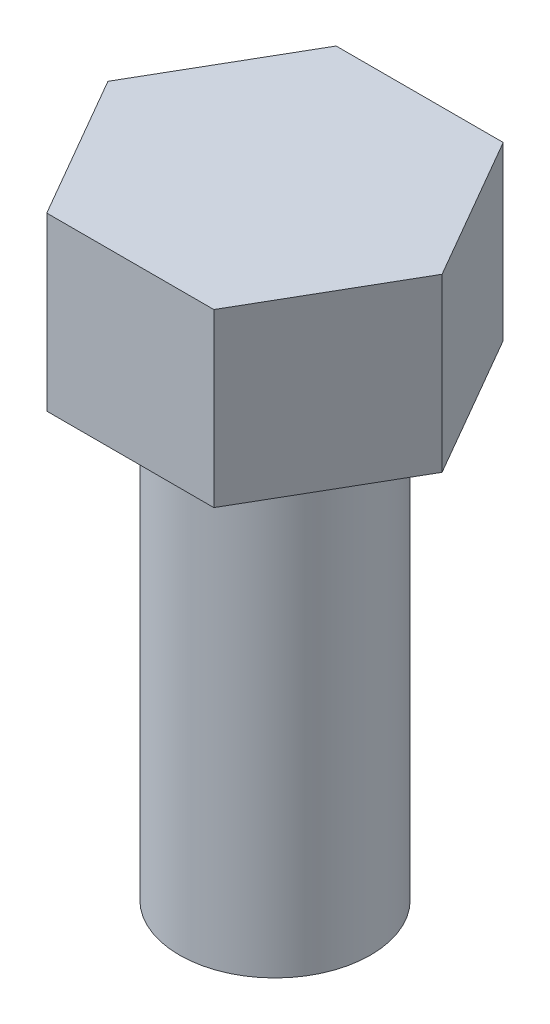
ISO-10303-21;
HEADER;
FILE_DESCRIPTION(('STEP AP214'),'2;1');
FILE_NAME('part.step','',(''),(''),'','','');
FILE_SCHEMA(('AUTOMOTIVE_DESIGN { 1 0 10303 214 1 1 1 1 }'));
ENDSEC;
DATA;
#1=APPLICATION_CONTEXT('core data for automotive mechanical design processes');
#2=APPLICATION_PROTOCOL_DEFINITION('international standard','automotive_design',2000,#1);
#3=PRODUCT_CONTEXT('',#1,'mechanical');
#4=PRODUCT('Part','Part','',(#3));
#5=PRODUCT_RELATED_PRODUCT_CATEGORY('part','',(#4));
#6=PRODUCT_DEFINITION_FORMATION('','',#4);
#7=PRODUCT_DEFINITION_CONTEXT('part definition',#1,'design');
#8=PRODUCT_DEFINITION('design','',#6,#7);
#9=PRODUCT_DEFINITION_SHAPE('','',#8);
#10=(LENGTH_UNIT() NAMED_UNIT(*) SI_UNIT(.MILLI.,.METRE.));
#11=(NAMED_UNIT(*) PLANE_ANGLE_UNIT() SI_UNIT($,.RADIAN.));
#12=(NAMED_UNIT(*) SI_UNIT($,.STERADIAN.) SOLID_ANGLE_UNIT());
#13=UNCERTAINTY_MEASURE_WITH_UNIT(LENGTH_MEASURE(1.E-05),#10,'distance_accuracy_value','');
#14=(GEOMETRIC_REPRESENTATION_CONTEXT(3) GLOBAL_UNCERTAINTY_ASSIGNED_CONTEXT((#13)) GLOBAL_UNIT_ASSIGNED_CONTEXT((#10,
#11,#12)) REPRESENTATION_CONTEXT('',''));
#15=CARTESIAN_POINT('',(0.,0.,0.));
#16=DIRECTION('',(0.,0.,1.));
#17=DIRECTION('',(1.,0.,0.));
#18=AXIS2_PLACEMENT_3D('',#15,#16,#17);
#19=CARTESIAN_POINT('',(2.33749999999999,4.8,-4.04866876269225));
#20=DIRECTION('',(0.,0.,1.));
#21=DIRECTION('',(1.,0.,0.));
#22=AXIS2_PLACEMENT_3D('',#19,#20,#21);
#23=PLANE('',#22);
#24=DIRECTION('',(-1.,0.,0.));
#25=VECTOR('',#24,1.);
#26=CARTESIAN_POINT('',(2.33749999999999,0.,-4.04866876269225));
#27=LINE('',#26,#25);
#28=CARTESIAN_POINT('',(2.33749999999999,0.,-4.04866876269225));
#29=VERTEX_POINT('',#28);
#30=CARTESIAN_POINT('',(-2.33749999999999,0.,-4.04866876269225));
#31=VERTEX_POINT('',#30);
#32=EDGE_CURVE('E132',#29,#31,#27,.T.);
#33=ORIENTED_EDGE('',*,*,#32,.T.);
#34=DIRECTION('',(0.,-1.,0.));
#35=VECTOR('',#34,1.);
#36=CARTESIAN_POINT('',(-2.33749999999999,4.8,-4.04866876269225));
#37=LINE('',#36,#35);
#38=CARTESIAN_POINT('',(-2.33749999999999,4.8,-4.04866876269225));
#39=VERTEX_POINT('',#38);
#40=EDGE_CURVE('E149',#39,#31,#37,.T.);
#41=ORIENTED_EDGE('',*,*,#40,.F.);
#42=DIRECTION('',(-1.,0.,0.));
#43=VECTOR('',#42,1.);
#44=CARTESIAN_POINT('',(2.33749999999999,4.8,-4.04866876269225));
#45=LINE('',#44,#43);
#46=CARTESIAN_POINT('',(2.33749999999999,4.8,-4.04866876269225));
#47=VERTEX_POINT('',#46);
#48=EDGE_CURVE('E142',#47,#39,#45,.T.);
#49=ORIENTED_EDGE('',*,*,#48,.F.);
#50=DIRECTION('',(0.,-1.,0.));
#51=VECTOR('',#50,1.);
#52=CARTESIAN_POINT('',(2.33749999999999,4.8,-4.04866876269225));
#53=LINE('',#52,#51);
#54=EDGE_CURVE('E128',#47,#29,#53,.T.);
#55=ORIENTED_EDGE('',*,*,#54,.T.);
#56=EDGE_LOOP('',(#33,#41,#49,#55));
#57=FACE_BOUND('',#56,.T.);
#58=ADVANCED_FACE('F45',(#57),#23,.F.);
#59=CARTESIAN_POINT('',(-2.33749999999999,4.8,-4.04866876269225));
#60=DIRECTION('',(0.866025403784438,0.,0.500000000000001));
#61=DIRECTION('',(0.500000000000001,0.,-0.866025403784438));
#62=AXIS2_PLACEMENT_3D('',#59,#60,#61);
#63=PLANE('',#62);
#64=DIRECTION('',(-0.500000000000001,0.,0.866025403784438));
#65=VECTOR('',#64,1.);
#66=CARTESIAN_POINT('',(-2.33749999999999,0.,-4.04866876269225));
#67=LINE('',#66,#65);
#68=CARTESIAN_POINT('',(-4.675,0.,0.));
#69=VERTEX_POINT('',#68);
#70=EDGE_CURVE('E135',#31,#69,#67,.T.);
#71=ORIENTED_EDGE('',*,*,#70,.T.);
#72=DIRECTION('',(0.,-1.,0.));
#73=VECTOR('',#72,1.);
#74=CARTESIAN_POINT('',(-4.675,4.8,0.));
#75=LINE('',#74,#73);
#76=CARTESIAN_POINT('',(-4.675,4.8,0.));
#77=VERTEX_POINT('',#76);
#78=EDGE_CURVE('E146',#77,#69,#75,.T.);
#79=ORIENTED_EDGE('',*,*,#78,.F.);
#80=DIRECTION('',(-0.500000000000001,0.,0.866025403784438));
#81=VECTOR('',#80,1.);
#82=CARTESIAN_POINT('',(-2.33749999999999,4.8,-4.04866876269225));
#83=LINE('',#82,#81);
#84=EDGE_CURVE('E101',#39,#77,#83,.T.);
#85=ORIENTED_EDGE('',*,*,#84,.F.);
#86=ORIENTED_EDGE('',*,*,#40,.T.);
#87=EDGE_LOOP('',(#71,#79,#85,#86));
#88=FACE_BOUND('',#87,.T.);
#89=ADVANCED_FACE('F171',(#88),#63,.F.);
#90=CARTESIAN_POINT('',(-4.675,4.8,0.));
#91=DIRECTION('',(0.866025403784438,0.,-0.500000000000001));
#92=DIRECTION('',(-0.500000000000001,0.,-0.866025403784438));
#93=AXIS2_PLACEMENT_3D('',#90,#91,#92);
#94=PLANE('',#93);
#95=DIRECTION('',(0.500000000000001,0.,0.866025403784438));
#96=VECTOR('',#95,1.);
#97=CARTESIAN_POINT('',(-4.675,0.,0.));
#98=LINE('',#97,#96);
#99=CARTESIAN_POINT('',(-2.33749999999999,0.,4.04866876269225));
#100=VERTEX_POINT('',#99);
#101=EDGE_CURVE('E137',#69,#100,#98,.T.);
#102=ORIENTED_EDGE('',*,*,#101,.T.);
#103=DIRECTION('',(0.,-1.,0.));
#104=VECTOR('',#103,1.);
#105=CARTESIAN_POINT('',(-2.33749999999999,4.8,4.04866876269225));
#106=LINE('',#105,#104);
#107=CARTESIAN_POINT('',(-2.33749999999999,4.8,4.04866876269225));
#108=VERTEX_POINT('',#107);
#109=EDGE_CURVE('E123',#108,#100,#106,.T.);
#110=ORIENTED_EDGE('',*,*,#109,.F.);
#111=DIRECTION('',(0.500000000000001,0.,0.866025403784438));
#112=VECTOR('',#111,1.);
#113=CARTESIAN_POINT('',(-4.675,4.8,0.));
#114=LINE('',#113,#112);
#115=EDGE_CURVE('E114',#77,#108,#114,.T.);
#116=ORIENTED_EDGE('',*,*,#115,.F.);
#117=ORIENTED_EDGE('',*,*,#78,.T.);
#118=EDGE_LOOP('',(#102,#110,#116,#117));
#119=FACE_BOUND('',#118,.T.);
#120=ADVANCED_FACE('F176',(#119),#94,.F.);
#121=CARTESIAN_POINT('',(-2.33749999999999,4.8,4.04866876269225));
#122=DIRECTION('',(0.,0.,-1.));
#123=DIRECTION('',(-1.,0.,0.));
#124=AXIS2_PLACEMENT_3D('',#121,#122,#123);
#125=PLANE('',#124);
#126=DIRECTION('',(1.,0.,0.));
#127=VECTOR('',#126,1.);
#128=CARTESIAN_POINT('',(-2.33749999999999,0.,4.04866876269225));
#129=LINE('',#128,#127);
#130=CARTESIAN_POINT('',(2.33749999999999,0.,4.04866876269225));
#131=VERTEX_POINT('',#130);
#132=EDGE_CURVE('E122',#100,#131,#129,.T.);
#133=ORIENTED_EDGE('',*,*,#132,.T.);
#134=DIRECTION('',(0.,-1.,0.));
#135=VECTOR('',#134,1.);
#136=CARTESIAN_POINT('',(2.33749999999999,4.8,4.04866876269225));
#137=LINE('',#136,#135);
#138=CARTESIAN_POINT('',(2.33749999999999,4.8,4.04866876269225));
#139=VERTEX_POINT('',#138);
#140=EDGE_CURVE('E119',#139,#131,#137,.T.);
#141=ORIENTED_EDGE('',*,*,#140,.F.);
#142=DIRECTION('',(1.,0.,0.));
#143=VECTOR('',#142,1.);
#144=CARTESIAN_POINT('',(-2.33749999999999,4.8,4.04866876269225));
#145=LINE('',#144,#143);
#146=EDGE_CURVE('E108',#108,#139,#145,.T.);
#147=ORIENTED_EDGE('',*,*,#146,.F.);
#148=ORIENTED_EDGE('',*,*,#109,.T.);
#149=EDGE_LOOP('',(#133,#141,#147,#148));
#150=FACE_BOUND('',#149,.T.);
#151=ADVANCED_FACE('F120',(#150),#125,.F.);
#152=CARTESIAN_POINT('',(2.33749999999999,4.8,4.04866876269225));
#153=DIRECTION('',(-0.866025403784439,0.,-0.499999999999999));
#154=DIRECTION('',(-0.499999999999999,0.,0.866025403784439));
#155=AXIS2_PLACEMENT_3D('',#152,#153,#154);
#156=PLANE('',#155);
#157=DIRECTION('',(0.499999999999999,0.,-0.866025403784439));
#158=VECTOR('',#157,1.);
#159=CARTESIAN_POINT('',(2.33749999999999,0.,4.04866876269225));
#160=LINE('',#159,#158);
#161=CARTESIAN_POINT('',(4.67499999999998,0.,0.));
#162=VERTEX_POINT('',#161);
#163=EDGE_CURVE('E86',#131,#162,#160,.T.);
#164=ORIENTED_EDGE('',*,*,#163,.T.);
#165=DIRECTION('',(0.,-1.,0.));
#166=VECTOR('',#165,1.);
#167=CARTESIAN_POINT('',(4.67499999999998,4.8,0.));
#168=LINE('',#167,#166);
#169=CARTESIAN_POINT('',(4.67499999999998,4.8,0.));
#170=VERTEX_POINT('',#169);
#171=EDGE_CURVE('E124',#170,#162,#168,.T.);
#172=ORIENTED_EDGE('',*,*,#171,.F.);
#173=DIRECTION('',(0.499999999999999,0.,-0.866025403784439));
#174=VECTOR('',#173,1.);
#175=CARTESIAN_POINT('',(2.33749999999999,4.8,4.04866876269225));
#176=LINE('',#175,#174);
#177=EDGE_CURVE('E112',#139,#170,#176,.T.);
#178=ORIENTED_EDGE('',*,*,#177,.F.);
#179=ORIENTED_EDGE('',*,*,#140,.T.);
#180=EDGE_LOOP('',(#164,#172,#178,#179));
#181=FACE_BOUND('',#180,.T.);
#182=ADVANCED_FACE('F126',(#181),#156,.F.);
#183=CARTESIAN_POINT('',(4.67499999999998,4.8,0.));
#184=DIRECTION('',(-0.866025403784439,0.,0.499999999999999));
#185=DIRECTION('',(0.499999999999999,0.,0.866025403784439));
#186=AXIS2_PLACEMENT_3D('',#183,#184,#185);
#187=PLANE('',#186);
#188=DIRECTION('',(-0.499999999999999,0.,-0.866025403784439));
#189=VECTOR('',#188,1.);
#190=CARTESIAN_POINT('',(4.67499999999998,0.,0.));
#191=LINE('',#190,#189);
#192=EDGE_CURVE('E92',#162,#29,#191,.T.);
#193=ORIENTED_EDGE('',*,*,#192,.T.);
#194=ORIENTED_EDGE('',*,*,#54,.F.);
#195=DIRECTION('',(-0.499999999999999,0.,-0.866025403784439));
#196=VECTOR('',#195,1.);
#197=CARTESIAN_POINT('',(4.67499999999998,4.8,0.));
#198=LINE('',#197,#196);
#199=EDGE_CURVE('E63',#170,#47,#198,.T.);
#200=ORIENTED_EDGE('',*,*,#199,.F.);
#201=ORIENTED_EDGE('',*,*,#171,.T.);
#202=EDGE_LOOP('',(#193,#194,#200,#201));
#203=FACE_BOUND('',#202,.T.);
#204=ADVANCED_FACE('F186',(#203),#187,.F.);
#205=CARTESIAN_POINT('',(0.,4.8,0.));
#206=DIRECTION('',(0.,1.,0.));
#207=DIRECTION('',(0.,0.,1.));
#208=AXIS2_PLACEMENT_3D('',#205,#206,#207);
#209=PLANE('',#208);
#210=ORIENTED_EDGE('',*,*,#48,.T.);
#211=ORIENTED_EDGE('',*,*,#84,.T.);
#212=ORIENTED_EDGE('',*,*,#115,.T.);
#213=ORIENTED_EDGE('',*,*,#146,.T.);
#214=ORIENTED_EDGE('',*,*,#177,.T.);
#215=ORIENTED_EDGE('',*,*,#199,.T.);
#216=EDGE_LOOP('',(#210,#211,#212,#213,#214,#215));
#217=FACE_BOUND('',#216,.T.);
#218=ADVANCED_FACE('F110',(#217),#209,.T.);
#219=CARTESIAN_POINT('',(0.,0.,0.));
#220=DIRECTION('',(0.,1.,0.));
#221=DIRECTION('',(0.,0.,1.));
#222=AXIS2_PLACEMENT_3D('',#219,#220,#221);
#223=PLANE('',#222);
#224=CARTESIAN_POINT('',(0.,0.,0.));
#225=DIRECTION('',(0.,1.,0.));
#226=DIRECTION('',(0.,0.,1.));
#227=AXIS2_PLACEMENT_3D('',#224,#225,#226);
#228=CIRCLE('',#227,2.925);
#229=CARTESIAN_POINT('',(0.,0.,2.925));
#230=VERTEX_POINT('',#229);
#231=EDGE_CURVE('E11',#230,#230,#228,.T.);
#232=ORIENTED_EDGE('',*,*,#231,.T.);
#233=EDGE_LOOP('',(#232));
#234=FACE_BOUND('',#233,.T.);
#235=ORIENTED_EDGE('',*,*,#32,.F.);
#236=ORIENTED_EDGE('',*,*,#192,.F.);
#237=ORIENTED_EDGE('',*,*,#163,.F.);
#238=ORIENTED_EDGE('',*,*,#132,.F.);
#239=ORIENTED_EDGE('',*,*,#101,.F.);
#240=ORIENTED_EDGE('',*,*,#70,.F.);
#241=EDGE_LOOP('',(#235,#236,#237,#238,#239,#240));
#242=FACE_BOUND('',#241,.T.);
#243=ADVANCED_FACE('F166',(#234,#242),#223,.F.);
#244=CARTESIAN_POINT('',(0.,-28.7,0.));
#245=DIRECTION('',(0.,1.,0.));
#246=DIRECTION('',(0.,0.,1.));
#247=AXIS2_PLACEMENT_3D('',#244,#245,#246);
#248=CYLINDRICAL_SURFACE('',#247,2.675);
#249=CARTESIAN_POINT('',(0.,-12.7,0.));
#250=DIRECTION('',(0.,1.,0.));
#251=DIRECTION('',(0.,0.,1.));
#252=AXIS2_PLACEMENT_3D('',#249,#250,#251);
#253=CIRCLE('',#252,2.675);
#254=CARTESIAN_POINT('',(0.,-12.7,2.675));
#255=VERTEX_POINT('',#254);
#256=EDGE_CURVE('E49',#255,#255,#253,.T.);
#257=ORIENTED_EDGE('',*,*,#256,.T.);
#258=EDGE_LOOP('',(#257));
#259=FACE_BOUND('',#258,.T.);
#260=CARTESIAN_POINT('',(0.,-0.25,0.));
#261=DIRECTION('',(0.,1.,0.));
#262=DIRECTION('',(0.,0.,1.));
#263=AXIS2_PLACEMENT_3D('',#260,#261,#262);
#264=CIRCLE('',#263,2.675);
#265=CARTESIAN_POINT('',(0.,-0.25,2.675));
#266=VERTEX_POINT('',#265);
#267=EDGE_CURVE('E55',#266,#266,#264,.F.);
#268=ORIENTED_EDGE('',*,*,#267,.T.);
#269=EDGE_LOOP('',(#268));
#270=FACE_BOUND('',#269,.T.);
#271=ADVANCED_FACE('F154',(#259,#270),#248,.T.);
#272=CARTESIAN_POINT('',(0.,-0.25,0.));
#273=DIRECTION('',(0.,1.,0.));
#274=DIRECTION('',(0.,0.,1.));
#275=AXIS2_PLACEMENT_3D('',#272,#273,#274);
#276=TOROIDAL_SURFACE('',#275,2.925,0.25);
#277=ORIENTED_EDGE('',*,*,#231,.F.);
#278=EDGE_LOOP('',(#277));
#279=FACE_BOUND('',#278,.T.);
#280=ORIENTED_EDGE('',*,*,#267,.F.);
#281=EDGE_LOOP('',(#280));
#282=FACE_BOUND('',#281,.T.);
#283=ADVANCED_FACE('F47',(#279,#282),#276,.F.);
#284=CARTESIAN_POINT('',(-7.14853692341989,-12.7,-4.04866876269225));
#285=DIRECTION('',(0.,1.,0.));
#286=DIRECTION('',(0.,0.,1.));
#287=AXIS2_PLACEMENT_3D('',#284,#285,#286);
#288=PLANE('',#287);
#289=ORIENTED_EDGE('',*,*,#256,.F.);
#290=EDGE_LOOP('',(#289));
#291=FACE_BOUND('',#290,.T.);
#292=ADVANCED_FACE('F157',(#291),#288,.F.);
#293=CLOSED_SHELL('',(#58,#89,#120,#151,#182,#204,#218,#243,#271,#283,#292));
#294=MANIFOLD_SOLID_BREP('B2',#293);
#295=ADVANCED_BREP_SHAPE_REPRESENTATION('',(#18,#294),#14);
#296=SHAPE_DEFINITION_REPRESENTATION(#9,#295);
ENDSEC;
END-ISO-10303-21;
